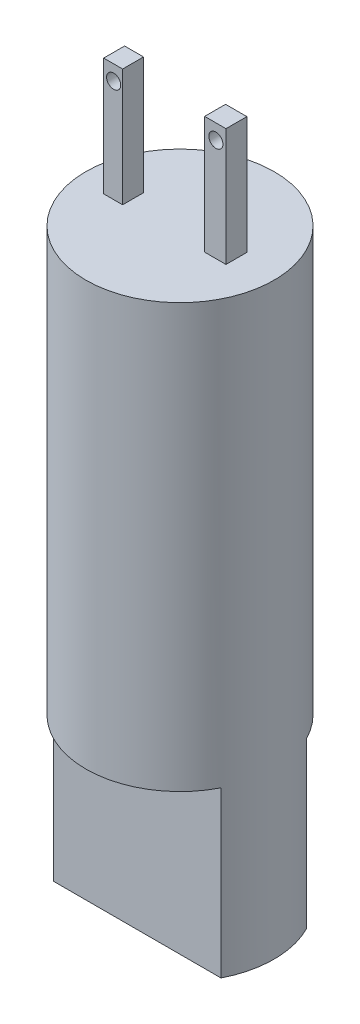
ISO-10303-21;
HEADER;
FILE_DESCRIPTION(('STEP AP214'),'2;1');
FILE_NAME('part.step','',(''),(''),'','','');
FILE_SCHEMA(('AUTOMOTIVE_DESIGN { 1 0 10303 214 1 1 1 1 }'));
ENDSEC;
DATA;
#1=APPLICATION_CONTEXT('core data for automotive mechanical design processes');
#2=APPLICATION_PROTOCOL_DEFINITION('international standard','automotive_design',2000,#1);
#3=PRODUCT_CONTEXT('',#1,'mechanical');
#4=PRODUCT('Part','Part','',(#3));
#5=PRODUCT_RELATED_PRODUCT_CATEGORY('part','',(#4));
#6=PRODUCT_DEFINITION_FORMATION('','',#4);
#7=PRODUCT_DEFINITION_CONTEXT('part definition',#1,'design');
#8=PRODUCT_DEFINITION('design','',#6,#7);
#9=PRODUCT_DEFINITION_SHAPE('','',#8);
#10=(LENGTH_UNIT() NAMED_UNIT(*) SI_UNIT(.MILLI.,.METRE.));
#11=(NAMED_UNIT(*) PLANE_ANGLE_UNIT() SI_UNIT($,.RADIAN.));
#12=(NAMED_UNIT(*) SI_UNIT($,.STERADIAN.) SOLID_ANGLE_UNIT());
#13=UNCERTAINTY_MEASURE_WITH_UNIT(LENGTH_MEASURE(1.E-05),#10,'distance_accuracy_value','');
#14=(GEOMETRIC_REPRESENTATION_CONTEXT(3) GLOBAL_UNCERTAINTY_ASSIGNED_CONTEXT((#13)) GLOBAL_UNIT_ASSIGNED_CONTEXT((#10,
#11,#12)) REPRESENTATION_CONTEXT('',''));
#15=CARTESIAN_POINT('',(0.,0.,0.));
#16=DIRECTION('',(0.,0.,1.));
#17=DIRECTION('',(1.,0.,0.));
#18=AXIS2_PLACEMENT_3D('',#15,#16,#17);
#19=CARTESIAN_POINT('',(0.,25.,0.));
#20=DIRECTION('',(0.,1.,0.));
#21=DIRECTION('',(0.,0.,1.));
#22=AXIS2_PLACEMENT_3D('',#19,#20,#21);
#23=PLANE('',#22);
#24=DIRECTION('',(-1.,0.,0.));
#25=VECTOR('',#24,1.);
#26=CARTESIAN_POINT('',(-2.8000589054572,25.,-0.444320724518571));
#27=LINE('',#26,#25);
#28=CARTESIAN_POINT('',(-1.99525155538567,25.,-0.444320724518571));
#29=VERTEX_POINT('',#28);
#30=CARTESIAN_POINT('',(-2.8000589054572,25.,-0.444320724518571));
#31=VERTEX_POINT('',#30);
#32=EDGE_CURVE('E154',#29,#31,#27,.T.);
#33=ORIENTED_EDGE('',*,*,#32,.F.);
#34=DIRECTION('',(0.,0.,-1.));
#35=VECTOR('',#34,1.);
#36=CARTESIAN_POINT('',(-1.99525155538567,25.,-0.444320724518571));
#37=LINE('',#36,#35);
#38=CARTESIAN_POINT('',(-1.99525155538567,25.,0.444320724518571));
#39=VERTEX_POINT('',#38);
#40=EDGE_CURVE('E151',#39,#29,#37,.T.);
#41=ORIENTED_EDGE('',*,*,#40,.F.);
#42=DIRECTION('',(1.,0.,0.));
#43=VECTOR('',#42,1.);
#44=CARTESIAN_POINT('',(-2.8000589054572,25.,0.444320724518571));
#45=LINE('',#44,#43);
#46=CARTESIAN_POINT('',(-2.8000589054572,25.,0.444320724518571));
#47=VERTEX_POINT('',#46);
#48=EDGE_CURVE('E163',#47,#39,#45,.T.);
#49=ORIENTED_EDGE('',*,*,#48,.F.);
#50=DIRECTION('',(0.,0.,1.));
#51=VECTOR('',#50,1.);
#52=CARTESIAN_POINT('',(-2.8000589054572,25.,-0.444320724518571));
#53=LINE('',#52,#51);
#54=EDGE_CURVE('E171',#31,#47,#53,.T.);
#55=ORIENTED_EDGE('',*,*,#54,.F.);
#56=EDGE_LOOP('',(#33,#41,#49,#55));
#57=FACE_BOUND('',#56,.T.);
#58=CARTESIAN_POINT('',(0.,25.,0.));
#59=DIRECTION('',(0.,1.,0.));
#60=DIRECTION('',(0.,0.,1.));
#61=AXIS2_PLACEMENT_3D('',#58,#59,#60);
#62=CIRCLE('',#61,4.);
#63=CARTESIAN_POINT('',(0.,25.,4.));
#64=VERTEX_POINT('',#63);
#65=EDGE_CURVE('E201',#64,#64,#62,.T.);
#66=ORIENTED_EDGE('',*,*,#65,.T.);
#67=EDGE_LOOP('',(#66));
#68=FACE_BOUND('',#67,.T.);
#69=DIRECTION('',(-1.,0.,0.));
#70=VECTOR('',#69,1.);
#71=CARTESIAN_POINT('',(1.49224696159097,25.,-0.444320724518571));
#72=LINE('',#71,#70);
#73=CARTESIAN_POINT('',(2.39765523042144,25.,-0.444320724518571));
#74=VERTEX_POINT('',#73);
#75=CARTESIAN_POINT('',(1.49224696159097,25.,-0.444320724518571));
#76=VERTEX_POINT('',#75);
#77=EDGE_CURVE('E218',#74,#76,#72,.T.);
#78=ORIENTED_EDGE('',*,*,#77,.F.);
#79=DIRECTION('',(0.,0.,-1.));
#80=VECTOR('',#79,1.);
#81=CARTESIAN_POINT('',(2.39765523042144,25.,-0.444320724518571));
#82=LINE('',#81,#80);
#83=CARTESIAN_POINT('',(2.39765523042144,25.,0.444320724518571));
#84=VERTEX_POINT('',#83);
#85=EDGE_CURVE('E149',#84,#74,#82,.T.);
#86=ORIENTED_EDGE('',*,*,#85,.F.);
#87=DIRECTION('',(1.,0.,0.));
#88=VECTOR('',#87,1.);
#89=CARTESIAN_POINT('',(1.49224696159097,25.,0.444320724518571));
#90=LINE('',#89,#88);
#91=CARTESIAN_POINT('',(1.49224696159097,25.,0.444320724518571));
#92=VERTEX_POINT('',#91);
#93=EDGE_CURVE('E145',#92,#84,#90,.T.);
#94=ORIENTED_EDGE('',*,*,#93,.F.);
#95=DIRECTION('',(0.,0.,1.));
#96=VECTOR('',#95,1.);
#97=CARTESIAN_POINT('',(1.49224696159097,25.,-0.444320724518571));
#98=LINE('',#97,#96);
#99=EDGE_CURVE('E232',#76,#92,#98,.T.);
#100=ORIENTED_EDGE('',*,*,#99,.F.);
#101=EDGE_LOOP('',(#78,#86,#94,#100));
#102=FACE_BOUND('',#101,.T.);
#103=ADVANCED_FACE('F34',(#57,#68,#102),#23,.T.);
#104=CARTESIAN_POINT('',(0.,25.,0.));
#105=DIRECTION('',(0.,-1.,0.));
#106=DIRECTION('',(0.,0.,-1.));
#107=AXIS2_PLACEMENT_3D('',#104,#105,#106);
#108=CYLINDRICAL_SURFACE('',#107,4.);
#109=ORIENTED_EDGE('',*,*,#65,.F.);
#110=EDGE_LOOP('',(#109));
#111=FACE_BOUND('',#110,.T.);
#112=CARTESIAN_POINT('',(0.,7.,0.));
#113=DIRECTION('',(0.,1.,0.));
#114=DIRECTION('',(0.,0.,1.));
#115=AXIS2_PLACEMENT_3D('',#112,#113,#114);
#116=CIRCLE('',#115,4.);
#117=CARTESIAN_POINT('',(-3.56237442597027,7.,1.81919994755744));
#118=VERTEX_POINT('',#117);
#119=CARTESIAN_POINT('',(3.56237442597027,7.,1.81919994755744));
#120=VERTEX_POINT('',#119);
#121=EDGE_CURVE('E11',#118,#120,#116,.T.);
#122=ORIENTED_EDGE('',*,*,#121,.T.);
#123=DIRECTION('',(0.,-1.,0.));
#124=VECTOR('',#123,1.);
#125=CARTESIAN_POINT('',(3.56237442597027,25.,1.81919994755744));
#126=LINE('',#125,#124);
#127=CARTESIAN_POINT('',(3.56237442597027,0.,1.81919994755744));
#128=VERTEX_POINT('',#127);
#129=EDGE_CURVE('E188',#120,#128,#126,.T.);
#130=ORIENTED_EDGE('',*,*,#129,.T.);
#131=CARTESIAN_POINT('',(0.,0.,0.));
#132=DIRECTION('',(0.,1.,0.));
#133=DIRECTION('',(0.,0.,1.));
#134=AXIS2_PLACEMENT_3D('',#131,#132,#133);
#135=CIRCLE('',#134,4.);
#136=CARTESIAN_POINT('',(3.56237442597027,0.,-1.81919994755744));
#137=VERTEX_POINT('',#136);
#138=EDGE_CURVE('E200',#128,#137,#135,.T.);
#139=ORIENTED_EDGE('',*,*,#138,.T.);
#140=DIRECTION('',(0.,-1.,0.));
#141=VECTOR('',#140,1.);
#142=CARTESIAN_POINT('',(3.56237442597027,25.,-1.81919994755744));
#143=LINE('',#142,#141);
#144=CARTESIAN_POINT('',(3.56237442597027,7.,-1.81919994755744));
#145=VERTEX_POINT('',#144);
#146=EDGE_CURVE('E194',#137,#145,#143,.F.);
#147=ORIENTED_EDGE('',*,*,#146,.T.);
#148=CARTESIAN_POINT('',(0.,7.,0.));
#149=DIRECTION('',(0.,-1.,0.));
#150=DIRECTION('',(0.,0.,-1.));
#151=AXIS2_PLACEMENT_3D('',#148,#149,#150);
#152=CIRCLE('',#151,4.);
#153=CARTESIAN_POINT('',(-3.56237442597027,7.,-1.81919994755744));
#154=VERTEX_POINT('',#153);
#155=EDGE_CURVE('E210',#154,#145,#152,.T.);
#156=ORIENTED_EDGE('',*,*,#155,.F.);
#157=DIRECTION('',(0.,-1.,0.));
#158=VECTOR('',#157,1.);
#159=CARTESIAN_POINT('',(-3.56237442597027,25.,-1.81919994755744));
#160=LINE('',#159,#158);
#161=CARTESIAN_POINT('',(-3.56237442597027,0.,-1.81919994755744));
#162=VERTEX_POINT('',#161);
#163=EDGE_CURVE('E197',#154,#162,#160,.T.);
#164=ORIENTED_EDGE('',*,*,#163,.T.);
#165=CARTESIAN_POINT('',(-3.56237442597027,0.,1.81919994755744));
#166=VERTEX_POINT('',#165);
#167=EDGE_CURVE('E205',#162,#166,#135,.T.);
#168=ORIENTED_EDGE('',*,*,#167,.T.);
#169=DIRECTION('',(0.,-1.,0.));
#170=VECTOR('',#169,1.);
#171=CARTESIAN_POINT('',(-3.56237442597027,25.,1.81919994755744));
#172=LINE('',#171,#170);
#173=EDGE_CURVE('E185',#166,#118,#172,.F.);
#174=ORIENTED_EDGE('',*,*,#173,.T.);
#175=EDGE_LOOP('',(#122,#130,#139,#147,#156,#164,#168,#174));
#176=FACE_BOUND('',#175,.T.);
#177=ADVANCED_FACE('F36',(#111,#176),#108,.T.);
#178=CARTESIAN_POINT('',(0.,0.,0.));
#179=DIRECTION('',(0.,1.,0.));
#180=DIRECTION('',(0.,0.,1.));
#181=AXIS2_PLACEMENT_3D('',#178,#179,#180);
#182=PLANE('',#181);
#183=ORIENTED_EDGE('',*,*,#138,.F.);
#184=DIRECTION('',(-1.,0.,0.));
#185=VECTOR('',#184,1.);
#186=CARTESIAN_POINT('',(0.,0.,1.81919994755744));
#187=LINE('',#186,#185);
#188=EDGE_CURVE('E43',#128,#166,#187,.T.);
#189=ORIENTED_EDGE('',*,*,#188,.T.);
#190=ORIENTED_EDGE('',*,*,#167,.F.);
#191=DIRECTION('',(1.,0.,0.));
#192=VECTOR('',#191,1.);
#193=CARTESIAN_POINT('',(0.,0.,-1.81919994755744));
#194=LINE('',#193,#192);
#195=EDGE_CURVE('E204',#162,#137,#194,.T.);
#196=ORIENTED_EDGE('',*,*,#195,.T.);
#197=EDGE_LOOP('',(#183,#189,#190,#196));
#198=FACE_BOUND('',#197,.T.);
#199=ADVANCED_FACE('F256',(#198),#182,.F.);
#200=CARTESIAN_POINT('',(0.,7.,0.840323552809152));
#201=DIRECTION('',(0.,-1.,0.));
#202=DIRECTION('',(0.,0.,-1.));
#203=AXIS2_PLACEMENT_3D('',#200,#201,#202);
#204=PLANE('',#203);
#205=ORIENTED_EDGE('',*,*,#155,.T.);
#206=DIRECTION('',(-1.,0.,0.));
#207=VECTOR('',#206,1.);
#208=CARTESIAN_POINT('',(-4.42644042539342,7.,-1.81919994755744));
#209=LINE('',#208,#207);
#210=EDGE_CURVE('E191',#145,#154,#209,.T.);
#211=ORIENTED_EDGE('',*,*,#210,.T.);
#212=EDGE_LOOP('',(#205,#211));
#213=FACE_BOUND('',#212,.T.);
#214=ADVANCED_FACE('F264',(#213),#204,.T.);
#215=CARTESIAN_POINT('',(-4.42644042539342,7.,-1.81919994755744));
#216=DIRECTION('',(0.,0.,1.));
#217=DIRECTION('',(1.,0.,0.));
#218=AXIS2_PLACEMENT_3D('',#215,#216,#217);
#219=PLANE('',#218);
#220=ORIENTED_EDGE('',*,*,#210,.F.);
#221=ORIENTED_EDGE('',*,*,#146,.F.);
#222=ORIENTED_EDGE('',*,*,#195,.F.);
#223=ORIENTED_EDGE('',*,*,#163,.F.);
#224=EDGE_LOOP('',(#220,#221,#222,#223));
#225=FACE_BOUND('',#224,.T.);
#226=ADVANCED_FACE('F261',(#225),#219,.F.);
#227=CARTESIAN_POINT('',(0.,7.,-1.0676829443108));
#228=DIRECTION('',(0.,1.,0.));
#229=DIRECTION('',(0.,0.,1.));
#230=AXIS2_PLACEMENT_3D('',#227,#228,#229);
#231=PLANE('',#230);
#232=DIRECTION('',(1.,0.,0.));
#233=VECTOR('',#232,1.);
#234=CARTESIAN_POINT('',(-4.42644042539342,7.,1.81919994755744));
#235=LINE('',#234,#233);
#236=EDGE_CURVE('E182',#118,#120,#235,.T.);
#237=ORIENTED_EDGE('',*,*,#236,.T.);
#238=ORIENTED_EDGE('',*,*,#121,.F.);
#239=EDGE_LOOP('',(#237,#238));
#240=FACE_BOUND('',#239,.T.);
#241=ADVANCED_FACE('F281',(#240),#231,.F.);
#242=CARTESIAN_POINT('',(-4.42644042539342,7.,1.81919994755744));
#243=DIRECTION('',(0.,0.,-1.));
#244=DIRECTION('',(-1.,0.,0.));
#245=AXIS2_PLACEMENT_3D('',#242,#243,#244);
#246=PLANE('',#245);
#247=ORIENTED_EDGE('',*,*,#236,.F.);
#248=ORIENTED_EDGE('',*,*,#173,.F.);
#249=ORIENTED_EDGE('',*,*,#188,.F.);
#250=ORIENTED_EDGE('',*,*,#129,.F.);
#251=EDGE_LOOP('',(#247,#248,#249,#250));
#252=FACE_BOUND('',#251,.T.);
#253=ADVANCED_FACE('F279',(#252),#246,.F.);
#254=CARTESIAN_POINT('',(-1.99525155538567,30.,-0.444320724518571));
#255=DIRECTION('',(-1.,0.,0.));
#256=DIRECTION('',(0.,0.,1.));
#257=AXIS2_PLACEMENT_3D('',#254,#255,#256);
#258=PLANE('',#257);
#259=ORIENTED_EDGE('',*,*,#40,.T.);
#260=DIRECTION('',(0.,-1.,0.));
#261=VECTOR('',#260,1.);
#262=CARTESIAN_POINT('',(-1.99525155538567,30.,-0.444320724518571));
#263=LINE('',#262,#261);
#264=CARTESIAN_POINT('',(-1.99525155538567,30.,-0.444320724518571));
#265=VERTEX_POINT('',#264);
#266=EDGE_CURVE('E180',#265,#29,#263,.T.);
#267=ORIENTED_EDGE('',*,*,#266,.F.);
#268=DIRECTION('',(0.,0.,-1.));
#269=VECTOR('',#268,1.);
#270=CARTESIAN_POINT('',(-1.99525155538567,30.,-0.444320724518571));
#271=LINE('',#270,#269);
#272=CARTESIAN_POINT('',(-1.99525155538567,30.,0.444320724518571));
#273=VERTEX_POINT('',#272);
#274=EDGE_CURVE('E159',#273,#265,#271,.T.);
#275=ORIENTED_EDGE('',*,*,#274,.F.);
#276=DIRECTION('',(0.,-1.,0.));
#277=VECTOR('',#276,1.);
#278=CARTESIAN_POINT('',(-1.99525155538567,30.,0.444320724518571));
#279=LINE('',#278,#277);
#280=EDGE_CURVE('E168',#273,#39,#279,.T.);
#281=ORIENTED_EDGE('',*,*,#280,.T.);
#282=EDGE_LOOP('',(#259,#267,#275,#281));
#283=FACE_BOUND('',#282,.T.);
#284=ADVANCED_FACE('F288',(#283),#258,.F.);
#285=CARTESIAN_POINT('',(-2.8000589054572,30.,-0.444320724518571));
#286=DIRECTION('',(0.,0.,1.));
#287=DIRECTION('',(1.,0.,0.));
#288=AXIS2_PLACEMENT_3D('',#285,#286,#287);
#289=PLANE('',#288);
#290=CARTESIAN_POINT('',(-2.37757375663974,29.3603873544061,-0.444320724518571));
#291=DIRECTION('',(0.,0.,-1.));
#292=DIRECTION('',(-1.,0.,0.));
#293=AXIS2_PLACEMENT_3D('',#290,#291,#292);
#294=CIRCLE('',#293,0.300000000000001);
#295=CARTESIAN_POINT('',(-2.67757375663974,29.3603873544061,-0.444320724518571));
#296=VERTEX_POINT('',#295);
#297=EDGE_CURVE('E225',#296,#296,#294,.T.);
#298=ORIENTED_EDGE('',*,*,#297,.F.);
#299=EDGE_LOOP('',(#298));
#300=FACE_BOUND('',#299,.T.);
#301=ORIENTED_EDGE('',*,*,#32,.T.);
#302=DIRECTION('',(0.,-1.,0.));
#303=VECTOR('',#302,1.);
#304=CARTESIAN_POINT('',(-2.8000589054572,30.,-0.444320724518571));
#305=LINE('',#304,#303);
#306=CARTESIAN_POINT('',(-2.8000589054572,30.,-0.444320724518571));
#307=VERTEX_POINT('',#306);
#308=EDGE_CURVE('E177',#307,#31,#305,.T.);
#309=ORIENTED_EDGE('',*,*,#308,.F.);
#310=DIRECTION('',(-1.,0.,0.));
#311=VECTOR('',#310,1.);
#312=CARTESIAN_POINT('',(-2.8000589054572,30.,-0.444320724518571));
#313=LINE('',#312,#311);
#314=EDGE_CURVE('E162',#265,#307,#313,.T.);
#315=ORIENTED_EDGE('',*,*,#314,.F.);
#316=ORIENTED_EDGE('',*,*,#266,.T.);
#317=EDGE_LOOP('',(#301,#309,#315,#316));
#318=FACE_BOUND('',#317,.T.);
#319=ADVANCED_FACE('F293',(#300,#318),#289,.F.);
#320=CARTESIAN_POINT('',(-2.8000589054572,30.,-0.444320724518571));
#321=DIRECTION('',(1.,0.,0.));
#322=DIRECTION('',(0.,0.,-1.));
#323=AXIS2_PLACEMENT_3D('',#320,#321,#322);
#324=PLANE('',#323);
#325=ORIENTED_EDGE('',*,*,#54,.T.);
#326=DIRECTION('',(0.,-1.,0.));
#327=VECTOR('',#326,1.);
#328=CARTESIAN_POINT('',(-2.8000589054572,30.,0.444320724518571));
#329=LINE('',#328,#327);
#330=CARTESIAN_POINT('',(-2.8000589054572,30.,0.444320724518571));
#331=VERTEX_POINT('',#330);
#332=EDGE_CURVE('E59',#331,#47,#329,.T.);
#333=ORIENTED_EDGE('',*,*,#332,.F.);
#334=DIRECTION('',(0.,0.,1.));
#335=VECTOR('',#334,1.);
#336=CARTESIAN_POINT('',(-2.8000589054572,30.,-0.444320724518571));
#337=LINE('',#336,#335);
#338=EDGE_CURVE('E165',#307,#331,#337,.T.);
#339=ORIENTED_EDGE('',*,*,#338,.F.);
#340=ORIENTED_EDGE('',*,*,#308,.T.);
#341=EDGE_LOOP('',(#325,#333,#339,#340));
#342=FACE_BOUND('',#341,.T.);
#343=ADVANCED_FACE('F297',(#342),#324,.F.);
#344=CARTESIAN_POINT('',(-2.8000589054572,30.,0.444320724518571));
#345=DIRECTION('',(0.,0.,-1.));
#346=DIRECTION('',(-1.,0.,0.));
#347=AXIS2_PLACEMENT_3D('',#344,#345,#346);
#348=PLANE('',#347);
#349=CARTESIAN_POINT('',(-2.37757375663974,29.3603873544061,0.444320724518571));
#350=DIRECTION('',(0.,0.,-1.));
#351=DIRECTION('',(-1.,0.,0.));
#352=AXIS2_PLACEMENT_3D('',#349,#350,#351);
#353=CIRCLE('',#352,0.300000000000001);
#354=CARTESIAN_POINT('',(-2.67757375663974,29.3603873544061,0.444320724518571));
#355=VERTEX_POINT('',#354);
#356=EDGE_CURVE('E38',#355,#355,#353,.T.);
#357=ORIENTED_EDGE('',*,*,#356,.T.);
#358=EDGE_LOOP('',(#357));
#359=FACE_BOUND('',#358,.T.);
#360=ORIENTED_EDGE('',*,*,#48,.T.);
#361=ORIENTED_EDGE('',*,*,#280,.F.);
#362=DIRECTION('',(1.,0.,0.));
#363=VECTOR('',#362,1.);
#364=CARTESIAN_POINT('',(-2.8000589054572,30.,0.444320724518571));
#365=LINE('',#364,#363);
#366=EDGE_CURVE('E167',#331,#273,#365,.T.);
#367=ORIENTED_EDGE('',*,*,#366,.F.);
#368=ORIENTED_EDGE('',*,*,#332,.T.);
#369=EDGE_LOOP('',(#360,#361,#367,#368));
#370=FACE_BOUND('',#369,.T.);
#371=ADVANCED_FACE('F301',(#359,#370),#348,.F.);
#372=CARTESIAN_POINT('',(0.,30.,0.));
#373=DIRECTION('',(0.,1.,0.));
#374=DIRECTION('',(0.,0.,1.));
#375=AXIS2_PLACEMENT_3D('',#372,#373,#374);
#376=PLANE('',#375);
#377=ORIENTED_EDGE('',*,*,#274,.T.);
#378=ORIENTED_EDGE('',*,*,#314,.T.);
#379=ORIENTED_EDGE('',*,*,#338,.T.);
#380=ORIENTED_EDGE('',*,*,#366,.T.);
#381=EDGE_LOOP('',(#377,#378,#379,#380));
#382=FACE_BOUND('',#381,.T.);
#383=ADVANCED_FACE('F305',(#382),#376,.T.);
#384=CARTESIAN_POINT('',(2.39765523042144,30.,-0.444320724518571));
#385=DIRECTION('',(-1.,0.,0.));
#386=DIRECTION('',(0.,0.,1.));
#387=AXIS2_PLACEMENT_3D('',#384,#385,#386);
#388=PLANE('',#387);
#389=ORIENTED_EDGE('',*,*,#85,.T.);
#390=DIRECTION('',(0.,-1.,0.));
#391=VECTOR('',#390,1.);
#392=CARTESIAN_POINT('',(2.39765523042144,30.,-0.444320724518571));
#393=LINE('',#392,#391);
#394=CARTESIAN_POINT('',(2.39765523042144,30.,-0.444320724518571));
#395=VERTEX_POINT('',#394);
#396=EDGE_CURVE('E130',#395,#74,#393,.T.);
#397=ORIENTED_EDGE('',*,*,#396,.F.);
#398=DIRECTION('',(0.,0.,-1.));
#399=VECTOR('',#398,1.);
#400=CARTESIAN_POINT('',(2.39765523042144,30.,-0.444320724518571));
#401=LINE('',#400,#399);
#402=CARTESIAN_POINT('',(2.39765523042144,30.,0.444320724518571));
#403=VERTEX_POINT('',#402);
#404=EDGE_CURVE('E137',#403,#395,#401,.T.);
#405=ORIENTED_EDGE('',*,*,#404,.F.);
#406=DIRECTION('',(0.,-1.,0.));
#407=VECTOR('',#406,1.);
#408=CARTESIAN_POINT('',(2.39765523042144,30.,0.444320724518571));
#409=LINE('',#408,#407);
#410=EDGE_CURVE('E229',#403,#84,#409,.T.);
#411=ORIENTED_EDGE('',*,*,#410,.T.);
#412=EDGE_LOOP('',(#389,#397,#405,#411));
#413=FACE_BOUND('',#412,.T.);
#414=ADVANCED_FACE('F147',(#413),#388,.F.);
#415=CARTESIAN_POINT('',(1.49224696159097,30.,-0.444320724518571));
#416=DIRECTION('',(0.,0.,1.));
#417=DIRECTION('',(1.,0.,0.));
#418=AXIS2_PLACEMENT_3D('',#415,#416,#417);
#419=PLANE('',#418);
#420=CARTESIAN_POINT('',(1.96815605874708,29.3603873544061,-0.444320724518571));
#421=DIRECTION('',(0.,0.,-1.));
#422=DIRECTION('',(-1.,0.,0.));
#423=AXIS2_PLACEMENT_3D('',#420,#421,#422);
#424=CIRCLE('',#423,0.3);
#425=CARTESIAN_POINT('',(1.66815605874708,29.3603873544061,-0.444320724518571));
#426=VERTEX_POINT('',#425);
#427=EDGE_CURVE('E215',#426,#426,#424,.T.);
#428=ORIENTED_EDGE('',*,*,#427,.F.);
#429=EDGE_LOOP('',(#428));
#430=FACE_BOUND('',#429,.T.);
#431=ORIENTED_EDGE('',*,*,#77,.T.);
#432=DIRECTION('',(0.,-1.,0.));
#433=VECTOR('',#432,1.);
#434=CARTESIAN_POINT('',(1.49224696159097,30.,-0.444320724518571));
#435=LINE('',#434,#433);
#436=CARTESIAN_POINT('',(1.49224696159097,30.,-0.444320724518571));
#437=VERTEX_POINT('',#436);
#438=EDGE_CURVE('E133',#437,#76,#435,.T.);
#439=ORIENTED_EDGE('',*,*,#438,.F.);
#440=DIRECTION('',(-1.,0.,0.));
#441=VECTOR('',#440,1.);
#442=CARTESIAN_POINT('',(1.49224696159097,30.,-0.444320724518571));
#443=LINE('',#442,#441);
#444=EDGE_CURVE('E126',#395,#437,#443,.T.);
#445=ORIENTED_EDGE('',*,*,#444,.F.);
#446=ORIENTED_EDGE('',*,*,#396,.T.);
#447=EDGE_LOOP('',(#431,#439,#445,#446));
#448=FACE_BOUND('',#447,.T.);
#449=ADVANCED_FACE('F128',(#430,#448),#419,.F.);
#450=CARTESIAN_POINT('',(1.49224696159097,30.,-0.444320724518571));
#451=DIRECTION('',(1.,0.,0.));
#452=DIRECTION('',(0.,0.,-1.));
#453=AXIS2_PLACEMENT_3D('',#450,#451,#452);
#454=PLANE('',#453);
#455=ORIENTED_EDGE('',*,*,#99,.T.);
#456=DIRECTION('',(0.,-1.,0.));
#457=VECTOR('',#456,1.);
#458=CARTESIAN_POINT('',(1.49224696159097,30.,0.444320724518571));
#459=LINE('',#458,#457);
#460=CARTESIAN_POINT('',(1.49224696159097,30.,0.444320724518571));
#461=VERTEX_POINT('',#460);
#462=EDGE_CURVE('E51',#461,#92,#459,.T.);
#463=ORIENTED_EDGE('',*,*,#462,.F.);
#464=DIRECTION('',(0.,0.,1.));
#465=VECTOR('',#464,1.);
#466=CARTESIAN_POINT('',(1.49224696159097,30.,-0.444320724518571));
#467=LINE('',#466,#465);
#468=EDGE_CURVE('E136',#437,#461,#467,.T.);
#469=ORIENTED_EDGE('',*,*,#468,.F.);
#470=ORIENTED_EDGE('',*,*,#438,.T.);
#471=EDGE_LOOP('',(#455,#463,#469,#470));
#472=FACE_BOUND('',#471,.T.);
#473=ADVANCED_FACE('F239',(#472),#454,.F.);
#474=CARTESIAN_POINT('',(1.49224696159097,30.,0.444320724518571));
#475=DIRECTION('',(0.,0.,-1.));
#476=DIRECTION('',(-1.,0.,0.));
#477=AXIS2_PLACEMENT_3D('',#474,#475,#476);
#478=PLANE('',#477);
#479=CARTESIAN_POINT('',(1.96815605874708,29.3603873544061,0.444320724518571));
#480=DIRECTION('',(0.,0.,-1.));
#481=DIRECTION('',(-1.,0.,0.));
#482=AXIS2_PLACEMENT_3D('',#479,#480,#481);
#483=CIRCLE('',#482,0.3);
#484=CARTESIAN_POINT('',(1.66815605874708,29.3603873544061,0.444320724518571));
#485=VERTEX_POINT('',#484);
#486=EDGE_CURVE('E213',#485,#485,#483,.T.);
#487=ORIENTED_EDGE('',*,*,#486,.T.);
#488=EDGE_LOOP('',(#487));
#489=FACE_BOUND('',#488,.T.);
#490=ORIENTED_EDGE('',*,*,#93,.T.);
#491=ORIENTED_EDGE('',*,*,#410,.F.);
#492=DIRECTION('',(1.,0.,0.));
#493=VECTOR('',#492,1.);
#494=CARTESIAN_POINT('',(1.49224696159097,30.,0.444320724518571));
#495=LINE('',#494,#493);
#496=EDGE_CURVE('E141',#461,#403,#495,.T.);
#497=ORIENTED_EDGE('',*,*,#496,.F.);
#498=ORIENTED_EDGE('',*,*,#462,.T.);
#499=EDGE_LOOP('',(#490,#491,#497,#498));
#500=FACE_BOUND('',#499,.T.);
#501=ADVANCED_FACE('F240',(#489,#500),#478,.F.);
#502=CARTESIAN_POINT('',(0.,30.,0.));
#503=DIRECTION('',(0.,1.,0.));
#504=DIRECTION('',(0.,0.,1.));
#505=AXIS2_PLACEMENT_3D('',#502,#503,#504);
#506=PLANE('',#505);
#507=ORIENTED_EDGE('',*,*,#404,.T.);
#508=ORIENTED_EDGE('',*,*,#444,.T.);
#509=ORIENTED_EDGE('',*,*,#468,.T.);
#510=ORIENTED_EDGE('',*,*,#496,.T.);
#511=EDGE_LOOP('',(#507,#508,#509,#510));
#512=FACE_BOUND('',#511,.T.);
#513=ADVANCED_FACE('F140',(#512),#506,.T.);
#514=CARTESIAN_POINT('',(1.96815605874708,29.3603873544061,4.55567927548143));
#515=DIRECTION('',(0.,0.,-1.));
#516=DIRECTION('',(-1.,0.,0.));
#517=AXIS2_PLACEMENT_3D('',#514,#515,#516);
#518=CYLINDRICAL_SURFACE('',#517,0.3);
#519=ORIENTED_EDGE('',*,*,#427,.T.);
#520=EDGE_LOOP('',(#519));
#521=FACE_BOUND('',#520,.T.);
#522=ORIENTED_EDGE('',*,*,#486,.F.);
#523=EDGE_LOOP('',(#522));
#524=FACE_BOUND('',#523,.T.);
#525=ADVANCED_FACE('F247',(#521,#524),#518,.F.);
#526=CARTESIAN_POINT('',(-2.37757375663974,29.3603873544061,4.55567927548143));
#527=DIRECTION('',(0.,0.,-1.));
#528=DIRECTION('',(-1.,0.,0.));
#529=AXIS2_PLACEMENT_3D('',#526,#527,#528);
#530=CYLINDRICAL_SURFACE('',#529,0.300000000000001);
#531=ORIENTED_EDGE('',*,*,#297,.T.);
#532=EDGE_LOOP('',(#531));
#533=FACE_BOUND('',#532,.T.);
#534=ORIENTED_EDGE('',*,*,#356,.F.);
#535=EDGE_LOOP('',(#534));
#536=FACE_BOUND('',#535,.T.);
#537=ADVANCED_FACE('F410',(#533,#536),#530,.F.);
#538=CLOSED_SHELL('',(#103,#177,#199,#214,#226,#241,#253,#284,#319,#343,#371,#383,#414,#449,
#473,#501,#513,#525,#537));
#539=MANIFOLD_SOLID_BREP('B2',#538);
#540=ADVANCED_BREP_SHAPE_REPRESENTATION('',(#18,#539),#14);
#541=SHAPE_DEFINITION_REPRESENTATION(#9,#540);
ENDSEC;
END-ISO-10303-21;
